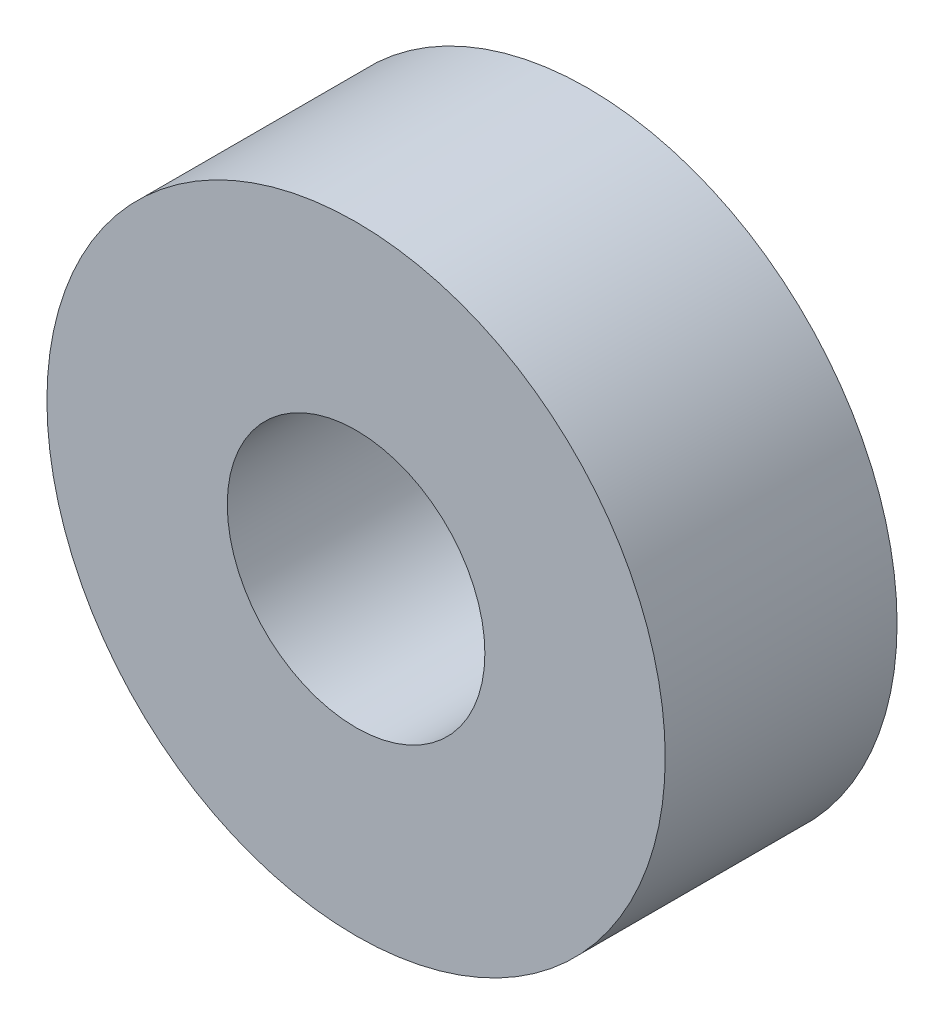
ISO-10303-21;
HEADER;
FILE_DESCRIPTION(('STEP AP214'),'2;1');
FILE_NAME('part.step','',(''),(''),'','','');
FILE_SCHEMA(('AUTOMOTIVE_DESIGN { 1 0 10303 214 1 1 1 1 }'));
ENDSEC;
DATA;
#1=APPLICATION_CONTEXT('core data for automotive mechanical design processes');
#2=APPLICATION_PROTOCOL_DEFINITION('international standard','automotive_design',2000,#1);
#3=PRODUCT_CONTEXT('',#1,'mechanical');
#4=PRODUCT('Part','Part','',(#3));
#5=PRODUCT_RELATED_PRODUCT_CATEGORY('part','',(#4));
#6=PRODUCT_DEFINITION_FORMATION('','',#4);
#7=PRODUCT_DEFINITION_CONTEXT('part definition',#1,'design');
#8=PRODUCT_DEFINITION('design','',#6,#7);
#9=PRODUCT_DEFINITION_SHAPE('','',#8);
#10=(LENGTH_UNIT() NAMED_UNIT(*) SI_UNIT(.MILLI.,.METRE.));
#11=(NAMED_UNIT(*) PLANE_ANGLE_UNIT() SI_UNIT($,.RADIAN.));
#12=(NAMED_UNIT(*) SI_UNIT($,.STERADIAN.) SOLID_ANGLE_UNIT());
#13=UNCERTAINTY_MEASURE_WITH_UNIT(LENGTH_MEASURE(1.E-05),#10,'distance_accuracy_value','');
#14=(GEOMETRIC_REPRESENTATION_CONTEXT(3) GLOBAL_UNCERTAINTY_ASSIGNED_CONTEXT((#13)) GLOBAL_UNIT_ASSIGNED_CONTEXT((#10,
#11,#12)) REPRESENTATION_CONTEXT('',''));
#15=CARTESIAN_POINT('',(0.,0.,0.));
#16=DIRECTION('',(0.,0.,1.));
#17=DIRECTION('',(1.,0.,0.));
#18=AXIS2_PLACEMENT_3D('',#15,#16,#17);
#19=CARTESIAN_POINT('',(521.379553039424,-27.9028406255293,9.));
#20=DIRECTION('',(0.,0.,1.));
#21=DIRECTION('',(1.,0.,0.));
#22=AXIS2_PLACEMENT_3D('',#19,#20,#21);
#23=PLANE('',#22);
#24=CARTESIAN_POINT('',(521.379553039424,-27.9028406255293,9.));
#25=DIRECTION('',(0.,0.,1.));
#26=DIRECTION('',(1.,0.,0.));
#27=AXIS2_PLACEMENT_3D('',#24,#25,#26);
#28=CIRCLE('',#27,12.);
#29=CARTESIAN_POINT('',(533.379553039424,-27.9028406255293,9.));
#30=VERTEX_POINT('',#29);
#31=EDGE_CURVE('E10',#30,#30,#28,.T.);
#32=ORIENTED_EDGE('',*,*,#31,.T.);
#33=EDGE_LOOP('',(#32));
#34=FACE_BOUND('',#33,.T.);
#35=CARTESIAN_POINT('',(521.379553039424,-27.9028406255293,9.));
#36=DIRECTION('',(0.,0.,1.));
#37=DIRECTION('',(1.,0.,0.));
#38=AXIS2_PLACEMENT_3D('',#35,#36,#37);
#39=CIRCLE('',#38,5.00000000000004);
#40=CARTESIAN_POINT('',(526.379553039424,-27.9028406255293,9.));
#41=VERTEX_POINT('',#40);
#42=EDGE_CURVE('E44',#41,#41,#39,.T.);
#43=ORIENTED_EDGE('',*,*,#42,.F.);
#44=EDGE_LOOP('',(#43));
#45=FACE_BOUND('',#44,.T.);
#46=ADVANCED_FACE('F33',(#34,#45),#23,.T.);
#47=CARTESIAN_POINT('',(521.379553039424,-27.9028406255293,0.));
#48=DIRECTION('',(0.,0.,1.));
#49=DIRECTION('',(1.,0.,0.));
#50=AXIS2_PLACEMENT_3D('',#47,#48,#49);
#51=PLANE('',#50);
#52=CARTESIAN_POINT('',(521.379553039424,-27.9028406255293,0.));
#53=DIRECTION('',(0.,0.,1.));
#54=DIRECTION('',(1.,0.,0.));
#55=AXIS2_PLACEMENT_3D('',#52,#53,#54);
#56=CIRCLE('',#55,12.);
#57=CARTESIAN_POINT('',(533.379553039424,-27.9028406255293,0.));
#58=VERTEX_POINT('',#57);
#59=EDGE_CURVE('E37',#58,#58,#56,.T.);
#60=ORIENTED_EDGE('',*,*,#59,.F.);
#61=EDGE_LOOP('',(#60));
#62=FACE_BOUND('',#61,.T.);
#63=CARTESIAN_POINT('',(521.379553039424,-27.9028406255293,0.));
#64=DIRECTION('',(0.,0.,1.));
#65=DIRECTION('',(1.,0.,0.));
#66=AXIS2_PLACEMENT_3D('',#63,#64,#65);
#67=CIRCLE('',#66,5.00000000000004);
#68=CARTESIAN_POINT('',(526.379553039424,-27.9028406255293,0.));
#69=VERTEX_POINT('',#68);
#70=EDGE_CURVE('E46',#69,#69,#67,.T.);
#71=ORIENTED_EDGE('',*,*,#70,.T.);
#72=EDGE_LOOP('',(#71));
#73=FACE_BOUND('',#72,.T.);
#74=ADVANCED_FACE('F56',(#62,#73),#51,.F.);
#75=CARTESIAN_POINT('',(521.379553039424,-27.9028406255293,9.));
#76=DIRECTION('',(0.,0.,-1.));
#77=DIRECTION('',(-1.,0.,0.));
#78=AXIS2_PLACEMENT_3D('',#75,#76,#77);
#79=CYLINDRICAL_SURFACE('',#78,12.);
#80=ORIENTED_EDGE('',*,*,#31,.F.);
#81=EDGE_LOOP('',(#80));
#82=FACE_BOUND('',#81,.T.);
#83=ORIENTED_EDGE('',*,*,#59,.T.);
#84=EDGE_LOOP('',(#83));
#85=FACE_BOUND('',#84,.T.);
#86=ADVANCED_FACE('F35',(#82,#85),#79,.T.);
#87=CARTESIAN_POINT('',(521.379553039424,-27.9028406255293,9.));
#88=DIRECTION('',(0.,0.,-1.));
#89=DIRECTION('',(-1.,0.,0.));
#90=AXIS2_PLACEMENT_3D('',#87,#88,#89);
#91=CYLINDRICAL_SURFACE('',#90,5.00000000000004);
#92=ORIENTED_EDGE('',*,*,#42,.T.);
#93=EDGE_LOOP('',(#92));
#94=FACE_BOUND('',#93,.T.);
#95=ORIENTED_EDGE('',*,*,#70,.F.);
#96=EDGE_LOOP('',(#95));
#97=FACE_BOUND('',#96,.T.);
#98=ADVANCED_FACE('F52',(#94,#97),#91,.F.);
#99=CLOSED_SHELL('',(#46,#74,#86,#98));
#100=MANIFOLD_SOLID_BREP('B2',#99);
#101=ADVANCED_BREP_SHAPE_REPRESENTATION('',(#18,#100),#14);
#102=SHAPE_DEFINITION_REPRESENTATION(#9,#101);
ENDSEC;
END-ISO-10303-21;
